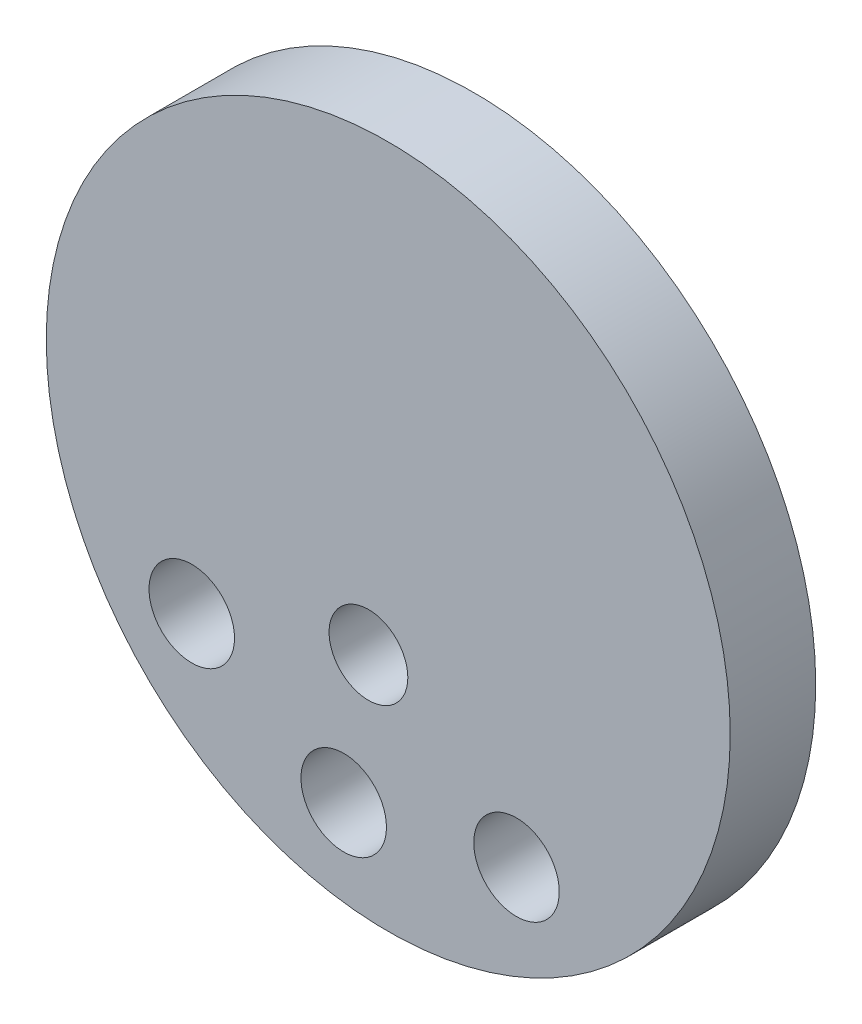
ISO-10303-21;
HEADER;
FILE_DESCRIPTION(('STEP AP214'),'2;1');
FILE_NAME('part.step','',(''),(''),'','','');
FILE_SCHEMA(('AUTOMOTIVE_DESIGN { 1 0 10303 214 1 1 1 1 }'));
ENDSEC;
DATA;
#1=APPLICATION_CONTEXT('core data for automotive mechanical design processes');
#2=APPLICATION_PROTOCOL_DEFINITION('international standard','automotive_design',2000,#1);
#3=PRODUCT_CONTEXT('',#1,'mechanical');
#4=PRODUCT('Part','Part','',(#3));
#5=PRODUCT_RELATED_PRODUCT_CATEGORY('part','',(#4));
#6=PRODUCT_DEFINITION_FORMATION('','',#4);
#7=PRODUCT_DEFINITION_CONTEXT('part definition',#1,'design');
#8=PRODUCT_DEFINITION('design','',#6,#7);
#9=PRODUCT_DEFINITION_SHAPE('','',#8);
#10=(LENGTH_UNIT() NAMED_UNIT(*) SI_UNIT(.MILLI.,.METRE.));
#11=(NAMED_UNIT(*) PLANE_ANGLE_UNIT() SI_UNIT($,.RADIAN.));
#12=(NAMED_UNIT(*) SI_UNIT($,.STERADIAN.) SOLID_ANGLE_UNIT());
#13=UNCERTAINTY_MEASURE_WITH_UNIT(LENGTH_MEASURE(1.E-05),#10,'distance_accuracy_value','');
#14=(GEOMETRIC_REPRESENTATION_CONTEXT(3) GLOBAL_UNCERTAINTY_ASSIGNED_CONTEXT((#13)) GLOBAL_UNIT_ASSIGNED_CONTEXT((#10,
#11,#12)) REPRESENTATION_CONTEXT('',''));
#15=CARTESIAN_POINT('',(0.,0.,0.));
#16=DIRECTION('',(0.,0.,1.));
#17=DIRECTION('',(1.,0.,0.));
#18=AXIS2_PLACEMENT_3D('',#15,#16,#17);
#19=CARTESIAN_POINT('',(0.,0.,5.));
#20=DIRECTION('',(0.,0.,-1.));
#21=DIRECTION('',(-1.,0.,0.));
#22=AXIS2_PLACEMENT_3D('',#19,#20,#21);
#23=CYLINDRICAL_SURFACE('',#22,19.9999999999996);
#24=CARTESIAN_POINT('',(0.,0.,5.));
#25=DIRECTION('',(0.,0.,1.));
#26=DIRECTION('',(1.,0.,0.));
#27=AXIS2_PLACEMENT_3D('',#24,#25,#26);
#28=CIRCLE('',#27,19.9999999999996);
#29=CARTESIAN_POINT('',(19.9999999999996,0.,5.));
#30=VERTEX_POINT('',#29);
#31=EDGE_CURVE('E10',#30,#30,#28,.T.);
#32=ORIENTED_EDGE('',*,*,#31,.F.);
#33=EDGE_LOOP('',(#32));
#34=FACE_BOUND('',#33,.T.);
#35=CARTESIAN_POINT('',(0.,0.,0.));
#36=DIRECTION('',(0.,0.,1.));
#37=DIRECTION('',(1.,0.,0.));
#38=AXIS2_PLACEMENT_3D('',#35,#36,#37);
#39=CIRCLE('',#38,19.9999999999996);
#40=CARTESIAN_POINT('',(19.9999999999996,0.,0.));
#41=VERTEX_POINT('',#40);
#42=EDGE_CURVE('E51',#41,#41,#39,.T.);
#43=ORIENTED_EDGE('',*,*,#42,.T.);
#44=EDGE_LOOP('',(#43));
#45=FACE_BOUND('',#44,.T.);
#46=ADVANCED_FACE('F43',(#34,#45),#23,.T.);
#47=CARTESIAN_POINT('',(0.,0.,5.));
#48=DIRECTION('',(0.,0.,1.));
#49=DIRECTION('',(1.,0.,0.));
#50=AXIS2_PLACEMENT_3D('',#47,#48,#49);
#51=PLANE('',#50);
#52=CARTESIAN_POINT('',(7.49999999999988,-12.9903810567667,5.));
#53=DIRECTION('',(0.,0.,1.));
#54=DIRECTION('',(1.,0.,0.));
#55=AXIS2_PLACEMENT_3D('',#52,#53,#54);
#56=CIRCLE('',#55,2.5);
#57=CARTESIAN_POINT('',(9.99999999999988,-12.9903810567667,5.));
#58=VERTEX_POINT('',#57);
#59=EDGE_CURVE('E67',#58,#58,#56,.T.);
#60=ORIENTED_EDGE('',*,*,#59,.F.);
#61=EDGE_LOOP('',(#60));
#62=FACE_BOUND('',#61,.T.);
#63=CARTESIAN_POINT('',(-1.15765509660634,-6.56538830277373,5.));
#64=DIRECTION('',(0.,0.,1.));
#65=DIRECTION('',(1.,0.,0.));
#66=AXIS2_PLACEMENT_3D('',#63,#64,#65);
#67=CIRCLE('',#66,2.30241850508825);
#68=CARTESIAN_POINT('',(1.14476340848192,-6.56538830277373,5.));
#69=VERTEX_POINT('',#68);
#70=EDGE_CURVE('E127',#69,#69,#67,.T.);
#71=ORIENTED_EDGE('',*,*,#70,.F.);
#72=EDGE_LOOP('',(#71));
#73=FACE_BOUND('',#72,.T.);
#74=CARTESIAN_POINT('',(-11.4906666467848,-9.64181414529795,5.));
#75=DIRECTION('',(0.,0.,1.));
#76=DIRECTION('',(1.,0.,0.));
#77=AXIS2_PLACEMENT_3D('',#74,#75,#76);
#78=CIRCLE('',#77,2.5);
#79=CARTESIAN_POINT('',(-8.99066664678478,-9.64181414529795,5.));
#80=VERTEX_POINT('',#79);
#81=EDGE_CURVE('E59',#80,#80,#78,.T.);
#82=ORIENTED_EDGE('',*,*,#81,.F.);
#83=EDGE_LOOP('',(#82));
#84=FACE_BOUND('',#83,.T.);
#85=CARTESIAN_POINT('',(-2.6047226650041,-14.7721162951831,5.));
#86=DIRECTION('',(0.,0.,1.));
#87=DIRECTION('',(1.,0.,0.));
#88=AXIS2_PLACEMENT_3D('',#85,#86,#87);
#89=CIRCLE('',#88,2.5);
#90=CARTESIAN_POINT('',(-0.104722665004106,-14.7721162951831,5.));
#91=VERTEX_POINT('',#90);
#92=EDGE_CURVE('E126',#91,#91,#89,.T.);
#93=ORIENTED_EDGE('',*,*,#92,.F.);
#94=EDGE_LOOP('',(#93));
#95=FACE_BOUND('',#94,.T.);
#96=ORIENTED_EDGE('',*,*,#31,.T.);
#97=EDGE_LOOP('',(#96));
#98=FACE_BOUND('',#97,.T.);
#99=ADVANCED_FACE('F94',(#62,#73,#84,#95,#98),#51,.T.);
#100=CARTESIAN_POINT('',(0.,0.,0.));
#101=DIRECTION('',(0.,0.,1.));
#102=DIRECTION('',(1.,0.,0.));
#103=AXIS2_PLACEMENT_3D('',#100,#101,#102);
#104=PLANE('',#103);
#105=CARTESIAN_POINT('',(7.49999999999988,-12.9903810567667,0.));
#106=DIRECTION('',(0.,0.,1.));
#107=DIRECTION('',(1.,0.,0.));
#108=AXIS2_PLACEMENT_3D('',#105,#106,#107);
#109=CIRCLE('',#108,2.5);
#110=CARTESIAN_POINT('',(9.99999999999988,-12.9903810567667,0.));
#111=VERTEX_POINT('',#110);
#112=EDGE_CURVE('E46',#111,#111,#109,.T.);
#113=ORIENTED_EDGE('',*,*,#112,.T.);
#114=EDGE_LOOP('',(#113));
#115=FACE_BOUND('',#114,.T.);
#116=CARTESIAN_POINT('',(-1.15765509660634,-6.56538830277373,0.));
#117=DIRECTION('',(0.,0.,1.));
#118=DIRECTION('',(1.,0.,0.));
#119=AXIS2_PLACEMENT_3D('',#116,#117,#118);
#120=CIRCLE('',#119,2.30241850508825);
#121=CARTESIAN_POINT('',(1.14476340848192,-6.56538830277373,0.));
#122=VERTEX_POINT('',#121);
#123=EDGE_CURVE('E70',#122,#122,#120,.T.);
#124=ORIENTED_EDGE('',*,*,#123,.T.);
#125=EDGE_LOOP('',(#124));
#126=FACE_BOUND('',#125,.T.);
#127=CARTESIAN_POINT('',(-11.4906666467848,-9.64181414529795,0.));
#128=DIRECTION('',(0.,0.,1.));
#129=DIRECTION('',(1.,0.,0.));
#130=AXIS2_PLACEMENT_3D('',#127,#128,#129);
#131=CIRCLE('',#130,2.5);
#132=CARTESIAN_POINT('',(-8.99066664678478,-9.64181414529795,0.));
#133=VERTEX_POINT('',#132);
#134=EDGE_CURVE('E66',#133,#133,#131,.T.);
#135=ORIENTED_EDGE('',*,*,#134,.T.);
#136=EDGE_LOOP('',(#135));
#137=FACE_BOUND('',#136,.T.);
#138=CARTESIAN_POINT('',(-2.6047226650041,-14.7721162951831,0.));
#139=DIRECTION('',(0.,0.,1.));
#140=DIRECTION('',(1.,0.,0.));
#141=AXIS2_PLACEMENT_3D('',#138,#139,#140);
#142=CIRCLE('',#141,2.5);
#143=CARTESIAN_POINT('',(-0.104722665004106,-14.7721162951831,0.));
#144=VERTEX_POINT('',#143);
#145=EDGE_CURVE('E62',#144,#144,#142,.T.);
#146=ORIENTED_EDGE('',*,*,#145,.T.);
#147=EDGE_LOOP('',(#146));
#148=FACE_BOUND('',#147,.T.);
#149=ORIENTED_EDGE('',*,*,#42,.F.);
#150=EDGE_LOOP('',(#149));
#151=FACE_BOUND('',#150,.T.);
#152=ADVANCED_FACE('F79',(#115,#126,#137,#148,#151),#104,.F.);
#153=CARTESIAN_POINT('',(-2.6047226650041,-14.7721162951831,-30.));
#154=DIRECTION('',(0.,0.,1.));
#155=DIRECTION('',(1.,0.,0.));
#156=AXIS2_PLACEMENT_3D('',#153,#154,#155);
#157=CYLINDRICAL_SURFACE('',#156,2.5);
#158=ORIENTED_EDGE('',*,*,#92,.T.);
#159=EDGE_LOOP('',(#158));
#160=FACE_BOUND('',#159,.T.);
#161=ORIENTED_EDGE('',*,*,#145,.F.);
#162=EDGE_LOOP('',(#161));
#163=FACE_BOUND('',#162,.T.);
#164=ADVANCED_FACE('F105',(#160,#163),#157,.F.);
#165=CARTESIAN_POINT('',(-11.4906666467848,-9.64181414529795,-30.));
#166=DIRECTION('',(0.,0.,1.));
#167=DIRECTION('',(1.,0.,0.));
#168=AXIS2_PLACEMENT_3D('',#165,#166,#167);
#169=CYLINDRICAL_SURFACE('',#168,2.5);
#170=ORIENTED_EDGE('',*,*,#81,.T.);
#171=EDGE_LOOP('',(#170));
#172=FACE_BOUND('',#171,.T.);
#173=ORIENTED_EDGE('',*,*,#134,.F.);
#174=EDGE_LOOP('',(#173));
#175=FACE_BOUND('',#174,.T.);
#176=ADVANCED_FACE('F89',(#172,#175),#169,.F.);
#177=CARTESIAN_POINT('',(-1.15765509660634,-6.56538830277373,-30.));
#178=DIRECTION('',(0.,0.,1.));
#179=DIRECTION('',(1.,0.,0.));
#180=AXIS2_PLACEMENT_3D('',#177,#178,#179);
#181=CYLINDRICAL_SURFACE('',#180,2.30241850508825);
#182=ORIENTED_EDGE('',*,*,#70,.T.);
#183=EDGE_LOOP('',(#182));
#184=FACE_BOUND('',#183,.T.);
#185=ORIENTED_EDGE('',*,*,#123,.F.);
#186=EDGE_LOOP('',(#185));
#187=FACE_BOUND('',#186,.T.);
#188=ADVANCED_FACE('F83',(#184,#187),#181,.F.);
#189=CARTESIAN_POINT('',(7.49999999999988,-12.9903810567667,-30.));
#190=DIRECTION('',(0.,0.,1.));
#191=DIRECTION('',(1.,0.,0.));
#192=AXIS2_PLACEMENT_3D('',#189,#190,#191);
#193=CYLINDRICAL_SURFACE('',#192,2.5);
#194=ORIENTED_EDGE('',*,*,#59,.T.);
#195=EDGE_LOOP('',(#194));
#196=FACE_BOUND('',#195,.T.);
#197=ORIENTED_EDGE('',*,*,#112,.F.);
#198=EDGE_LOOP('',(#197));
#199=FACE_BOUND('',#198,.T.);
#200=ADVANCED_FACE('F81',(#196,#199),#193,.F.);
#201=CLOSED_SHELL('',(#46,#99,#152,#164,#176,#188,#200));
#202=MANIFOLD_SOLID_BREP('B2',#201);
#203=ADVANCED_BREP_SHAPE_REPRESENTATION('',(#18,#202),#14);
#204=SHAPE_DEFINITION_REPRESENTATION(#9,#203);
ENDSEC;
END-ISO-10303-21;
